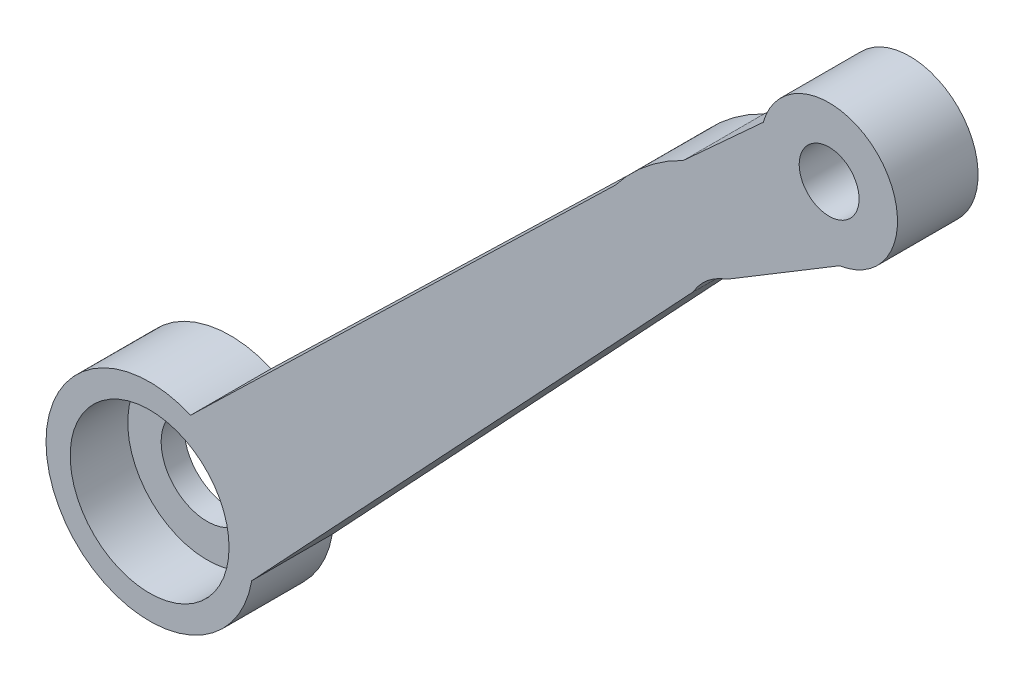
ISO-10303-21;
HEADER;
FILE_DESCRIPTION(('STEP AP214'),'2;1');
FILE_NAME('part.step','',(''),(''),'','','');
FILE_SCHEMA(('AUTOMOTIVE_DESIGN { 1 0 10303 214 1 1 1 1 }'));
ENDSEC;
DATA;
#1=APPLICATION_CONTEXT('core data for automotive mechanical design processes');
#2=APPLICATION_PROTOCOL_DEFINITION('international standard','automotive_design',2000,#1);
#3=PRODUCT_CONTEXT('',#1,'mechanical');
#4=PRODUCT('Part','Part','',(#3));
#5=PRODUCT_RELATED_PRODUCT_CATEGORY('part','',(#4));
#6=PRODUCT_DEFINITION_FORMATION('','',#4);
#7=PRODUCT_DEFINITION_CONTEXT('part definition',#1,'design');
#8=PRODUCT_DEFINITION('design','',#6,#7);
#9=PRODUCT_DEFINITION_SHAPE('','',#8);
#10=(LENGTH_UNIT() NAMED_UNIT(*) SI_UNIT(.MILLI.,.METRE.));
#11=(NAMED_UNIT(*) PLANE_ANGLE_UNIT() SI_UNIT($,.RADIAN.));
#12=(NAMED_UNIT(*) SI_UNIT($,.STERADIAN.) SOLID_ANGLE_UNIT());
#13=UNCERTAINTY_MEASURE_WITH_UNIT(LENGTH_MEASURE(1.E-05),#10,'distance_accuracy_value','');
#14=(GEOMETRIC_REPRESENTATION_CONTEXT(3) GLOBAL_UNCERTAINTY_ASSIGNED_CONTEXT((#13)) GLOBAL_UNIT_ASSIGNED_CONTEXT((#10,
#11,#12)) REPRESENTATION_CONTEXT('',''));
#15=CARTESIAN_POINT('',(0.,0.,0.));
#16=DIRECTION('',(0.,0.,1.));
#17=DIRECTION('',(1.,0.,0.));
#18=AXIS2_PLACEMENT_3D('',#15,#16,#17);
#19=CARTESIAN_POINT('',(-124.987033060666,-71.5953334018292,5.));
#20=DIRECTION('',(0.,0.,1.));
#21=DIRECTION('',(1.,0.,0.));
#22=AXIS2_PLACEMENT_3D('',#19,#20,#21);
#23=PLANE('',#22);
#24=CARTESIAN_POINT('',(-65.9691971319888,-18.0264477850223,5.));
#25=DIRECTION('',(0.,0.,1.));
#26=DIRECTION('',(1.,0.,0.));
#27=AXIS2_PLACEMENT_3D('',#24,#25,#26);
#28=CIRCLE('',#27,2.6);
#29=CARTESIAN_POINT('',(-63.3691971319888,-18.0264477850223,5.));
#30=VERTEX_POINT('',#29);
#31=EDGE_CURVE('E148',#30,#30,#28,.T.);
#32=ORIENTED_EDGE('',*,*,#31,.F.);
#33=EDGE_LOOP('',(#32));
#34=FACE_BOUND('',#33,.T.);
#35=CARTESIAN_POINT('',(-124.987033060666,-71.5953334018292,5.));
#36=DIRECTION('',(0.,0.,1.));
#37=DIRECTION('',(1.,0.,0.));
#38=AXIS2_PLACEMENT_3D('',#35,#36,#37);
#39=CIRCLE('',#38,8.99999999999999);
#40=CARTESIAN_POINT('',(-121.430579380583,-63.3278285048592,5.));
#41=VERTEX_POINT('',#40);
#42=CARTESIAN_POINT('',(-116.1164594661,-73.1161634723462,5.));
#43=VERTEX_POINT('',#42);
#44=EDGE_CURVE('E106',#41,#43,#39,.T.);
#45=ORIENTED_EDGE('',*,*,#44,.T.);
#46=DIRECTION('',(0.683917048390765,0.729559778853291,0.));
#47=VECTOR('',#46,1.);
#48=CARTESIAN_POINT('',(-116.1164594661,-73.1161634723462,5.));
#49=LINE('',#48,#47);
#50=CARTESIAN_POINT('',(-77.7803956143709,-32.2216568482133,5.));
#51=VERTEX_POINT('',#50);
#52=EDGE_CURVE('E154',#43,#51,#49,.T.);
#53=ORIENTED_EDGE('',*,*,#52,.T.);
#54=CARTESIAN_POINT('',(-73.0977404303763,-34.9110323199174,5.));
#55=DIRECTION('',(0.,0.,-1.));
#56=DIRECTION('',(1.,0.,0.));
#57=AXIS2_PLACEMENT_3D('',#54,#55,#56);
#58=CIRCLE('',#57,5.3999999999995);
#59=CARTESIAN_POINT('',(-74.8335154636347,-29.7976102726078,5.));
#60=VERTEX_POINT('',#59);
#61=EDGE_CURVE('E156',#51,#60,#58,.T.);
#62=ORIENTED_EDGE('',*,*,#61,.T.);
#63=DIRECTION('',(0.856088074759195,0.51682996067865,0.));
#64=VECTOR('',#63,1.);
#65=CARTESIAN_POINT('',(-74.8335154636347,-29.7976102726078,5.));
#66=LINE('',#65,#64);
#67=CARTESIAN_POINT('',(-65.0582692039829,-23.8961846028003,5.));
#68=VERTEX_POINT('',#67);
#69=EDGE_CURVE('E158',#60,#68,#66,.T.);
#70=ORIENTED_EDGE('',*,*,#69,.T.);
#71=CARTESIAN_POINT('',(-65.9691971319888,-18.0264477850223,5.));
#72=DIRECTION('',(0.,0.,1.));
#73=DIRECTION('',(1.,0.,0.));
#74=AXIS2_PLACEMENT_3D('',#71,#72,#73);
#75=CIRCLE('',#74,5.94000000000004);
#76=CARTESIAN_POINT('',(-71.6871646112254,-16.4175823753646,5.));
#77=VERTEX_POINT('',#76);
#78=EDGE_CURVE('E160',#68,#77,#75,.T.);
#79=ORIENTED_EDGE('',*,*,#78,.T.);
#80=DIRECTION('',(-0.738432343533464,-0.674327571751057,0.));
#81=VECTOR('',#80,1.);
#82=CARTESIAN_POINT('',(-71.6871646112254,-16.4175823753646,5.));
#83=LINE('',#82,#81);
#84=CARTESIAN_POINT('',(-78.6359414645846,-22.7631221708506,5.));
#85=VERTEX_POINT('',#84);
#86=EDGE_CURVE('E162',#77,#85,#83,.T.);
#87=ORIENTED_EDGE('',*,*,#86,.T.);
#88=CARTESIAN_POINT('',(-71.4000509723581,-37.6650229871914,5.));
#89=DIRECTION('',(0.,0.,1.));
#90=DIRECTION('',(1.,0.,0.));
#91=AXIS2_PLACEMENT_3D('',#88,#89,#90);
#92=CIRCLE('',#91,16.5657707081666);
#93=CARTESIAN_POINT('',(-84.5297017660568,-27.5636849970498,5.));
#94=VERTEX_POINT('',#93);
#95=EDGE_CURVE('E57',#85,#94,#92,.T.);
#96=ORIENTED_EDGE('',*,*,#95,.T.);
#97=DIRECTION('',(-0.718080536459822,-0.695960015487653,0.));
#98=VECTOR('',#97,1.);
#99=CARTESIAN_POINT('',(-84.5297017660568,-27.5636849970498,5.));
#100=LINE('',#99,#98);
#101=EDGE_CURVE('E52',#94,#41,#100,.T.);
#102=ORIENTED_EDGE('',*,*,#101,.T.);
#103=EDGE_LOOP('',(#45,#53,#62,#70,#79,#87,#96,#102));
#104=FACE_BOUND('',#103,.T.);
#105=CARTESIAN_POINT('',(-124.987033060666,-71.5953334018292,5.));
#106=DIRECTION('',(0.,0.,1.));
#107=DIRECTION('',(1.,0.,0.));
#108=AXIS2_PLACEMENT_3D('',#105,#106,#107);
#109=CIRCLE('',#108,6.90000000000001);
#110=CARTESIAN_POINT('',(-118.087033060666,-71.5953334018292,5.));
#111=VERTEX_POINT('',#110);
#112=EDGE_CURVE('E145',#111,#111,#109,.T.);
#113=ORIENTED_EDGE('',*,*,#112,.F.);
#114=EDGE_LOOP('',(#113));
#115=FACE_BOUND('',#114,.T.);
#116=ADVANCED_FACE('F37',(#34,#104,#115),#23,.T.);
#117=CARTESIAN_POINT('',(-124.987033060666,-71.5953334018292,5.));
#118=DIRECTION('',(0.,0.,-1.));
#119=DIRECTION('',(-1.,0.,0.));
#120=AXIS2_PLACEMENT_3D('',#117,#118,#119);
#121=CYLINDRICAL_SURFACE('',#120,8.99999999999999);
#122=DIRECTION('',(0.,0.,-1.));
#123=VECTOR('',#122,1.);
#124=CARTESIAN_POINT('',(-121.430579380583,-63.3278285048592,5.));
#125=LINE('',#124,#123);
#126=CARTESIAN_POINT('',(-121.430579380583,-63.3278285048592,-2.));
#127=VERTEX_POINT('',#126);
#128=EDGE_CURVE('E101',#41,#127,#125,.T.);
#129=ORIENTED_EDGE('',*,*,#128,.T.);
#130=CARTESIAN_POINT('',(-124.987033060666,-71.5953334018292,-2.));
#131=DIRECTION('',(0.,0.,-1.));
#132=DIRECTION('',(-1.,0.,0.));
#133=AXIS2_PLACEMENT_3D('',#130,#131,#132);
#134=CIRCLE('',#133,8.99999999999999);
#135=CARTESIAN_POINT('',(-116.1164594661,-73.1161634723462,-2.));
#136=VERTEX_POINT('',#135);
#137=EDGE_CURVE('E105',#136,#127,#134,.T.);
#138=ORIENTED_EDGE('',*,*,#137,.F.);
#139=DIRECTION('',(0.,0.,-1.));
#140=VECTOR('',#139,1.);
#141=CARTESIAN_POINT('',(-116.1164594661,-73.1161634723462,5.));
#142=LINE('',#141,#140);
#143=EDGE_CURVE('E11',#43,#136,#142,.T.);
#144=ORIENTED_EDGE('',*,*,#143,.F.);
#145=ORIENTED_EDGE('',*,*,#44,.F.);
#146=EDGE_LOOP('',(#129,#138,#144,#145));
#147=FACE_BOUND('',#146,.T.);
#148=ADVANCED_FACE('F39',(#147),#121,.T.);
#149=CARTESIAN_POINT('',(-116.1164594661,-73.1161634723462,5.));
#150=DIRECTION('',(-0.729559778853291,0.683917048390765,0.));
#151=DIRECTION('',(-0.683917048390765,-0.729559778853291,0.));
#152=AXIS2_PLACEMENT_3D('',#149,#150,#151);
#153=PLANE('',#152);
#154=ORIENTED_EDGE('',*,*,#143,.T.);
#155=DIRECTION('',(-0.683917048390765,-0.729559778853291,0.));
#156=VECTOR('',#155,1.);
#157=CARTESIAN_POINT('',(-77.7803956143709,-32.2216568482133,-2.));
#158=LINE('',#157,#156);
#159=CARTESIAN_POINT('',(-77.7803956143709,-32.2216568482133,-2.));
#160=VERTEX_POINT('',#159);
#161=EDGE_CURVE('E123',#160,#136,#158,.T.);
#162=ORIENTED_EDGE('',*,*,#161,.F.);
#163=DIRECTION('',(0.,0.,-1.));
#164=VECTOR('',#163,1.);
#165=CARTESIAN_POINT('',(-77.7803956143709,-32.2216568482133,5.));
#166=LINE('',#165,#164);
#167=EDGE_CURVE('E45',#51,#160,#166,.T.);
#168=ORIENTED_EDGE('',*,*,#167,.F.);
#169=ORIENTED_EDGE('',*,*,#52,.F.);
#170=EDGE_LOOP('',(#154,#162,#168,#169));
#171=FACE_BOUND('',#170,.T.);
#172=ADVANCED_FACE('F182',(#171),#153,.F.);
#173=CARTESIAN_POINT('',(-73.0977404303763,-34.9110323199174,5.));
#174=DIRECTION('',(0.,0.,-1.));
#175=DIRECTION('',(-1.,0.,0.));
#176=AXIS2_PLACEMENT_3D('',#173,#174,#175);
#177=CYLINDRICAL_SURFACE('',#176,5.3999999999995);
#178=ORIENTED_EDGE('',*,*,#167,.T.);
#179=CARTESIAN_POINT('',(-73.0977404303763,-34.9110323199174,-2.));
#180=DIRECTION('',(0.,0.,1.));
#181=DIRECTION('',(-1.,0.,0.));
#182=AXIS2_PLACEMENT_3D('',#179,#180,#181);
#183=CIRCLE('',#182,5.3999999999995);
#184=CARTESIAN_POINT('',(-74.8335154636347,-29.7976102726078,-2.));
#185=VERTEX_POINT('',#184);
#186=EDGE_CURVE('E141',#185,#160,#183,.T.);
#187=ORIENTED_EDGE('',*,*,#186,.F.);
#188=DIRECTION('',(0.,0.,-1.));
#189=VECTOR('',#188,1.);
#190=CARTESIAN_POINT('',(-74.8335154636347,-29.7976102726078,5.));
#191=LINE('',#190,#189);
#192=EDGE_CURVE('E173',#60,#185,#191,.T.);
#193=ORIENTED_EDGE('',*,*,#192,.F.);
#194=ORIENTED_EDGE('',*,*,#61,.F.);
#195=EDGE_LOOP('',(#178,#187,#193,#194));
#196=FACE_BOUND('',#195,.T.);
#197=ADVANCED_FACE('F178',(#196),#177,.F.);
#198=CARTESIAN_POINT('',(-74.8335154636347,-29.7976102726078,5.));
#199=DIRECTION('',(-0.51682996067865,0.856088074759195,0.));
#200=DIRECTION('',(-0.856088074759195,-0.51682996067865,0.));
#201=AXIS2_PLACEMENT_3D('',#198,#199,#200);
#202=PLANE('',#201);
#203=ORIENTED_EDGE('',*,*,#192,.T.);
#204=DIRECTION('',(-0.856088074759194,-0.516829960678652,0.));
#205=VECTOR('',#204,1.);
#206=CARTESIAN_POINT('',(-65.0582692039829,-23.8961846028003,-2.));
#207=LINE('',#206,#205);
#208=CARTESIAN_POINT('',(-65.0582692039829,-23.8961846028003,-2.));
#209=VERTEX_POINT('',#208);
#210=EDGE_CURVE('E138',#209,#185,#207,.T.);
#211=ORIENTED_EDGE('',*,*,#210,.F.);
#212=DIRECTION('',(0.,0.,-1.));
#213=VECTOR('',#212,1.);
#214=CARTESIAN_POINT('',(-65.0582692039829,-23.8961846028003,5.));
#215=LINE('',#214,#213);
#216=EDGE_CURVE('E171',#68,#209,#215,.T.);
#217=ORIENTED_EDGE('',*,*,#216,.F.);
#218=ORIENTED_EDGE('',*,*,#69,.F.);
#219=EDGE_LOOP('',(#203,#211,#217,#218));
#220=FACE_BOUND('',#219,.T.);
#221=ADVANCED_FACE('F225',(#220),#202,.F.);
#222=CARTESIAN_POINT('',(-65.9691971319888,-18.0264477850223,5.));
#223=DIRECTION('',(0.,0.,-1.));
#224=DIRECTION('',(-1.,0.,0.));
#225=AXIS2_PLACEMENT_3D('',#222,#223,#224);
#226=CYLINDRICAL_SURFACE('',#225,5.94000000000004);
#227=ORIENTED_EDGE('',*,*,#216,.T.);
#228=CARTESIAN_POINT('',(-65.9691971319888,-18.0264477850223,-2.));
#229=DIRECTION('',(0.,0.,-1.));
#230=DIRECTION('',(-1.,0.,0.));
#231=AXIS2_PLACEMENT_3D('',#228,#229,#230);
#232=CIRCLE('',#231,5.94000000000001);
#233=CARTESIAN_POINT('',(-71.6871646112254,-16.4175823753646,-2.));
#234=VERTEX_POINT('',#233);
#235=EDGE_CURVE('E135',#234,#209,#232,.T.);
#236=ORIENTED_EDGE('',*,*,#235,.F.);
#237=DIRECTION('',(0.,0.,-1.));
#238=VECTOR('',#237,1.);
#239=CARTESIAN_POINT('',(-71.6871646112254,-16.4175823753646,5.));
#240=LINE('',#239,#238);
#241=EDGE_CURVE('E169',#77,#234,#240,.T.);
#242=ORIENTED_EDGE('',*,*,#241,.F.);
#243=ORIENTED_EDGE('',*,*,#78,.F.);
#244=EDGE_LOOP('',(#227,#236,#242,#243));
#245=FACE_BOUND('',#244,.T.);
#246=ADVANCED_FACE('F221',(#245),#226,.T.);
#247=CARTESIAN_POINT('',(-71.6871646112254,-16.4175823753646,5.));
#248=DIRECTION('',(0.674327571751057,-0.738432343533464,0.));
#249=DIRECTION('',(0.738432343533464,0.674327571751057,0.));
#250=AXIS2_PLACEMENT_3D('',#247,#248,#249);
#251=PLANE('',#250);
#252=ORIENTED_EDGE('',*,*,#241,.T.);
#253=DIRECTION('',(0.738432343533464,0.674327571751057,0.));
#254=VECTOR('',#253,1.);
#255=CARTESIAN_POINT('',(-78.6359414645846,-22.7631221708506,-2.));
#256=LINE('',#255,#254);
#257=CARTESIAN_POINT('',(-78.6359414645846,-22.7631221708506,-2.));
#258=VERTEX_POINT('',#257);
#259=EDGE_CURVE('E132',#258,#234,#256,.T.);
#260=ORIENTED_EDGE('',*,*,#259,.F.);
#261=DIRECTION('',(0.,0.,-1.));
#262=VECTOR('',#261,1.);
#263=CARTESIAN_POINT('',(-78.6359414645846,-22.7631221708506,5.));
#264=LINE('',#263,#262);
#265=EDGE_CURVE('E167',#85,#258,#264,.T.);
#266=ORIENTED_EDGE('',*,*,#265,.F.);
#267=ORIENTED_EDGE('',*,*,#86,.F.);
#268=EDGE_LOOP('',(#252,#260,#266,#267));
#269=FACE_BOUND('',#268,.T.);
#270=ADVANCED_FACE('F217',(#269),#251,.F.);
#271=CARTESIAN_POINT('',(-71.4000509723581,-37.6650229871914,5.));
#272=DIRECTION('',(0.,0.,-1.));
#273=DIRECTION('',(-1.,0.,0.));
#274=AXIS2_PLACEMENT_3D('',#271,#272,#273);
#275=CYLINDRICAL_SURFACE('',#274,16.5657707081666);
#276=ORIENTED_EDGE('',*,*,#265,.T.);
#277=CARTESIAN_POINT('',(-71.4000509723581,-37.6650229871914,-2.));
#278=DIRECTION('',(0.,0.,-1.));
#279=DIRECTION('',(-1.,0.,0.));
#280=AXIS2_PLACEMENT_3D('',#277,#278,#279);
#281=CIRCLE('',#280,16.5657707081666);
#282=CARTESIAN_POINT('',(-84.5297017660568,-27.5636849970498,-2.));
#283=VERTEX_POINT('',#282);
#284=EDGE_CURVE('E116',#283,#258,#281,.T.);
#285=ORIENTED_EDGE('',*,*,#284,.F.);
#286=DIRECTION('',(0.,0.,-1.));
#287=VECTOR('',#286,1.);
#288=CARTESIAN_POINT('',(-84.5297017660568,-27.5636849970498,5.));
#289=LINE('',#288,#287);
#290=EDGE_CURVE('E108',#94,#283,#289,.T.);
#291=ORIENTED_EDGE('',*,*,#290,.F.);
#292=ORIENTED_EDGE('',*,*,#95,.F.);
#293=EDGE_LOOP('',(#276,#285,#291,#292));
#294=FACE_BOUND('',#293,.T.);
#295=ADVANCED_FACE('F214',(#294),#275,.T.);
#296=CARTESIAN_POINT('',(-84.5297017660568,-27.5636849970498,5.));
#297=DIRECTION('',(0.695960015487653,-0.718080536459822,0.));
#298=DIRECTION('',(0.718080536459822,0.695960015487653,0.));
#299=AXIS2_PLACEMENT_3D('',#296,#297,#298);
#300=PLANE('',#299);
#301=ORIENTED_EDGE('',*,*,#290,.T.);
#302=DIRECTION('',(0.718080536459822,0.695960015487653,0.));
#303=VECTOR('',#302,1.);
#304=CARTESIAN_POINT('',(-121.430579380583,-63.3278285048592,-2.));
#305=LINE('',#304,#303);
#306=EDGE_CURVE('E111',#127,#283,#305,.T.);
#307=ORIENTED_EDGE('',*,*,#306,.F.);
#308=ORIENTED_EDGE('',*,*,#128,.F.);
#309=ORIENTED_EDGE('',*,*,#101,.F.);
#310=EDGE_LOOP('',(#301,#307,#308,#309));
#311=FACE_BOUND('',#310,.T.);
#312=ADVANCED_FACE('F112',(#311),#300,.F.);
#313=CARTESIAN_POINT('',(-65.9691971319888,-18.0264477850223,5.));
#314=DIRECTION('',(0.,0.,-1.));
#315=DIRECTION('',(-1.,0.,0.));
#316=AXIS2_PLACEMENT_3D('',#313,#314,#315);
#317=CYLINDRICAL_SURFACE('',#316,2.6);
#318=ORIENTED_EDGE('',*,*,#31,.T.);
#319=EDGE_LOOP('',(#318));
#320=FACE_BOUND('',#319,.T.);
#321=CARTESIAN_POINT('',(-65.9691971319888,-18.0264477850223,-2.));
#322=DIRECTION('',(0.,0.,-1.));
#323=DIRECTION('',(-1.,0.,0.));
#324=AXIS2_PLACEMENT_3D('',#321,#322,#323);
#325=CIRCLE('',#324,2.6);
#326=CARTESIAN_POINT('',(-68.5691971319888,-18.0264477850223,-2.));
#327=VERTEX_POINT('',#326);
#328=EDGE_CURVE('E363',#327,#327,#325,.T.);
#329=ORIENTED_EDGE('',*,*,#328,.T.);
#330=EDGE_LOOP('',(#329));
#331=FACE_BOUND('',#330,.T.);
#332=ADVANCED_FACE('F193',(#320,#331),#317,.F.);
#333=CARTESIAN_POINT('',(-124.987033060666,-71.5953334018292,5.));
#334=DIRECTION('',(0.,0.,-1.));
#335=DIRECTION('',(-1.,0.,0.));
#336=AXIS2_PLACEMENT_3D('',#333,#334,#335);
#337=CYLINDRICAL_SURFACE('',#336,6.90000000000001);
#338=ORIENTED_EDGE('',*,*,#112,.T.);
#339=EDGE_LOOP('',(#338));
#340=FACE_BOUND('',#339,.T.);
#341=CARTESIAN_POINT('',(-124.987033060666,-71.5953334018292,0.));
#342=DIRECTION('',(0.,0.,1.));
#343=DIRECTION('',(1.,0.,0.));
#344=AXIS2_PLACEMENT_3D('',#341,#342,#343);
#345=CIRCLE('',#344,6.90000000000001);
#346=CARTESIAN_POINT('',(-118.087033060666,-71.5953334018292,0.));
#347=VERTEX_POINT('',#346);
#348=EDGE_CURVE('E144',#347,#347,#345,.T.);
#349=ORIENTED_EDGE('',*,*,#348,.F.);
#350=EDGE_LOOP('',(#349));
#351=FACE_BOUND('',#350,.T.);
#352=ADVANCED_FACE('F189',(#340,#351),#337,.F.);
#353=CARTESIAN_POINT('',(-124.987033060666,-71.5953334018292,0.));
#354=DIRECTION('',(0.,0.,-1.));
#355=DIRECTION('',(-1.,0.,0.));
#356=AXIS2_PLACEMENT_3D('',#353,#354,#355);
#357=PLANE('',#356);
#358=CARTESIAN_POINT('',(-124.987033060666,-71.5953334018292,0.));
#359=DIRECTION('',(0.,0.,-1.));
#360=DIRECTION('',(-1.,0.,0.));
#361=AXIS2_PLACEMENT_3D('',#358,#359,#360);
#362=CIRCLE('',#361,3.99999999999998);
#363=CARTESIAN_POINT('',(-128.987033060666,-71.5953334018292,0.));
#364=VERTEX_POINT('',#363);
#365=EDGE_CURVE('E127',#364,#364,#362,.T.);
#366=ORIENTED_EDGE('',*,*,#365,.T.);
#367=EDGE_LOOP('',(#366));
#368=FACE_BOUND('',#367,.T.);
#369=ORIENTED_EDGE('',*,*,#348,.T.);
#370=EDGE_LOOP('',(#369));
#371=FACE_BOUND('',#370,.T.);
#372=ADVANCED_FACE('F192',(#368,#371),#357,.F.);
#373=CARTESIAN_POINT('',(-124.987033060666,-71.5953334018292,-2.));
#374=DIRECTION('',(0.,0.,-1.));
#375=DIRECTION('',(-1.,0.,0.));
#376=AXIS2_PLACEMENT_3D('',#373,#374,#375);
#377=PLANE('',#376);
#378=CARTESIAN_POINT('',(-124.987033060666,-71.5953334018292,-2.));
#379=DIRECTION('',(0.,0.,-1.));
#380=DIRECTION('',(-1.,0.,0.));
#381=AXIS2_PLACEMENT_3D('',#378,#379,#380);
#382=CIRCLE('',#381,3.99999999999998);
#383=CARTESIAN_POINT('',(-128.987033060666,-71.5953334018292,-2.));
#384=VERTEX_POINT('',#383);
#385=EDGE_CURVE('E124',#384,#384,#382,.T.);
#386=ORIENTED_EDGE('',*,*,#385,.F.);
#387=EDGE_LOOP('',(#386));
#388=FACE_BOUND('',#387,.T.);
#389=ORIENTED_EDGE('',*,*,#137,.T.);
#390=ORIENTED_EDGE('',*,*,#306,.T.);
#391=ORIENTED_EDGE('',*,*,#284,.T.);
#392=ORIENTED_EDGE('',*,*,#259,.T.);
#393=ORIENTED_EDGE('',*,*,#235,.T.);
#394=ORIENTED_EDGE('',*,*,#210,.T.);
#395=ORIENTED_EDGE('',*,*,#186,.T.);
#396=ORIENTED_EDGE('',*,*,#161,.T.);
#397=EDGE_LOOP('',(#389,#390,#391,#392,#393,#394,#395,#396));
#398=FACE_BOUND('',#397,.T.);
#399=ORIENTED_EDGE('',*,*,#328,.F.);
#400=EDGE_LOOP('',(#399));
#401=FACE_BOUND('',#400,.T.);
#402=ADVANCED_FACE('F119',(#388,#398,#401),#377,.T.);
#403=CARTESIAN_POINT('',(-124.987033060666,-71.5953334018292,-2.));
#404=DIRECTION('',(0.,0.,1.));
#405=DIRECTION('',(1.,0.,0.));
#406=AXIS2_PLACEMENT_3D('',#403,#404,#405);
#407=CYLINDRICAL_SURFACE('',#406,3.99999999999998);
#408=ORIENTED_EDGE('',*,*,#385,.T.);
#409=EDGE_LOOP('',(#408));
#410=FACE_BOUND('',#409,.T.);
#411=ORIENTED_EDGE('',*,*,#365,.F.);
#412=EDGE_LOOP('',(#411));
#413=FACE_BOUND('',#412,.T.);
#414=ADVANCED_FACE('F203',(#410,#413),#407,.F.);
#415=CLOSED_SHELL('',(#116,#148,#172,#197,#221,#246,#270,#295,#312,#332,#352,#372,#402,#414));
#416=MANIFOLD_SOLID_BREP('B2',#415);
#417=ADVANCED_BREP_SHAPE_REPRESENTATION('',(#18,#416),#14);
#418=SHAPE_DEFINITION_REPRESENTATION(#9,#417);
ENDSEC;
END-ISO-10303-21;
